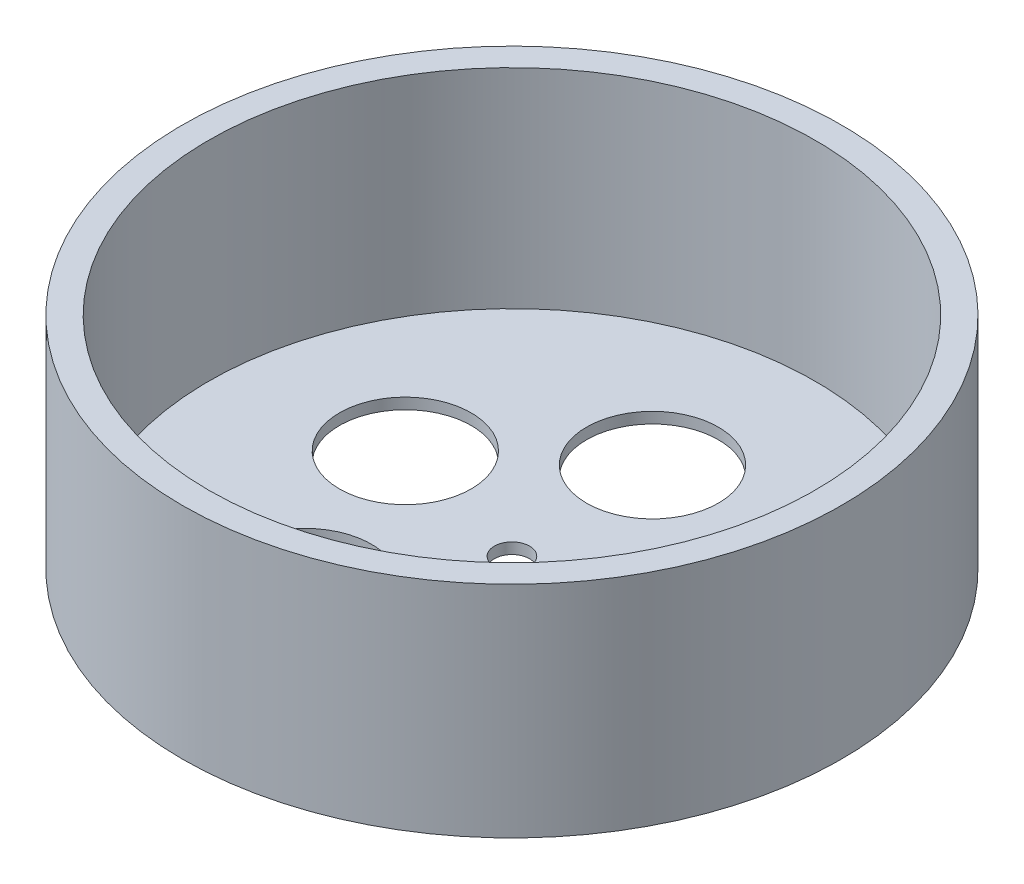
ISO-10303-21;
HEADER;
FILE_DESCRIPTION(('STEP AP214'),'2;1');
FILE_NAME('part.step','',(''),(''),'','','');
FILE_SCHEMA(('AUTOMOTIVE_DESIGN { 1 0 10303 214 1 1 1 1 }'));
ENDSEC;
DATA;
#1=APPLICATION_CONTEXT('core data for automotive mechanical design processes');
#2=APPLICATION_PROTOCOL_DEFINITION('international standard','automotive_design',2000,#1);
#3=PRODUCT_CONTEXT('',#1,'mechanical');
#4=PRODUCT('Part','Part','',(#3));
#5=PRODUCT_RELATED_PRODUCT_CATEGORY('part','',(#4));
#6=PRODUCT_DEFINITION_FORMATION('','',#4);
#7=PRODUCT_DEFINITION_CONTEXT('part definition',#1,'design');
#8=PRODUCT_DEFINITION('design','',#6,#7);
#9=PRODUCT_DEFINITION_SHAPE('','',#8);
#10=(LENGTH_UNIT() NAMED_UNIT(*) SI_UNIT(.MILLI.,.METRE.));
#11=(NAMED_UNIT(*) PLANE_ANGLE_UNIT() SI_UNIT($,.RADIAN.));
#12=(NAMED_UNIT(*) SI_UNIT($,.STERADIAN.) SOLID_ANGLE_UNIT());
#13=UNCERTAINTY_MEASURE_WITH_UNIT(LENGTH_MEASURE(1.E-05),#10,'distance_accuracy_value','');
#14=(GEOMETRIC_REPRESENTATION_CONTEXT(3) GLOBAL_UNCERTAINTY_ASSIGNED_CONTEXT((#13)) GLOBAL_UNIT_ASSIGNED_CONTEXT((#10,
#11,#12)) REPRESENTATION_CONTEXT('',''));
#15=CARTESIAN_POINT('',(0.,0.,0.));
#16=DIRECTION('',(0.,0.,1.));
#17=DIRECTION('',(1.,0.,0.));
#18=AXIS2_PLACEMENT_3D('',#15,#16,#17);
#19=CARTESIAN_POINT('',(0.,1.,0.));
#20=DIRECTION('',(0.,-1.,0.));
#21=DIRECTION('',(0.,0.,-1.));
#22=AXIS2_PLACEMENT_3D('',#19,#20,#21);
#23=CYLINDRICAL_SURFACE('',#22,1.5);
#24=CARTESIAN_POINT('',(0.,1.,0.));
#25=DIRECTION('',(0.,1.,0.));
#26=DIRECTION('',(0.,0.,1.));
#27=AXIS2_PLACEMENT_3D('',#24,#25,#26);
#28=CIRCLE('',#27,1.5);
#29=CARTESIAN_POINT('',(0.,1.,1.5));
#30=VERTEX_POINT('',#29);
#31=EDGE_CURVE('E10',#30,#30,#28,.T.);
#32=ORIENTED_EDGE('',*,*,#31,.F.);
#33=EDGE_LOOP('',(#32));
#34=FACE_BOUND('',#33,.T.);
#35=CARTESIAN_POINT('',(0.,0.,0.));
#36=DIRECTION('',(0.,1.,0.));
#37=DIRECTION('',(0.,0.,1.));
#38=AXIS2_PLACEMENT_3D('',#35,#36,#37);
#39=CIRCLE('',#38,1.5);
#40=CARTESIAN_POINT('',(0.,0.,1.5));
#41=VERTEX_POINT('',#40);
#42=EDGE_CURVE('E39',#41,#41,#39,.T.);
#43=ORIENTED_EDGE('',*,*,#42,.T.);
#44=EDGE_LOOP('',(#43));
#45=FACE_BOUND('',#44,.T.);
#46=ADVANCED_FACE('F36',(#34,#45),#23,.T.);
#47=CARTESIAN_POINT('',(0.,1.,0.));
#48=DIRECTION('',(0.,1.,0.));
#49=DIRECTION('',(0.,0.,1.));
#50=AXIS2_PLACEMENT_3D('',#47,#48,#49);
#51=PLANE('',#50);
#52=CARTESIAN_POINT('',(0.,1.,0.));
#53=DIRECTION('',(0.,1.,0.));
#54=DIRECTION('',(0.,0.,1.));
#55=AXIS2_PLACEMENT_3D('',#52,#53,#54);
#56=CIRCLE('',#55,1.38);
#57=CARTESIAN_POINT('',(0.,1.,1.38));
#58=VERTEX_POINT('',#57);
#59=EDGE_CURVE('E50',#58,#58,#56,.T.);
#60=ORIENTED_EDGE('',*,*,#59,.F.);
#61=EDGE_LOOP('',(#60));
#62=FACE_BOUND('',#61,.T.);
#63=ORIENTED_EDGE('',*,*,#31,.T.);
#64=EDGE_LOOP('',(#63));
#65=FACE_BOUND('',#64,.T.);
#66=ADVANCED_FACE('F133',(#62,#65),#51,.T.);
#67=CARTESIAN_POINT('',(0.,0.,0.));
#68=DIRECTION('',(0.,1.,0.));
#69=DIRECTION('',(0.,0.,1.));
#70=AXIS2_PLACEMENT_3D('',#67,#68,#69);
#71=PLANE('',#70);
#72=CARTESIAN_POINT('',(0.,0.,0.));
#73=DIRECTION('',(0.,1.,0.));
#74=DIRECTION('',(0.,0.,1.));
#75=AXIS2_PLACEMENT_3D('',#72,#73,#74);
#76=CIRCLE('',#75,0.08);
#77=CARTESIAN_POINT('',(0.,0.,0.08));
#78=VERTEX_POINT('',#77);
#79=EDGE_CURVE('E94',#78,#78,#76,.T.);
#80=ORIENTED_EDGE('',*,*,#79,.T.);
#81=EDGE_LOOP('',(#80));
#82=FACE_BOUND('',#81,.T.);
#83=CARTESIAN_POINT('',(0.43074259853327,0.,0.526175649197898));
#84=DIRECTION('',(0.,1.,0.));
#85=DIRECTION('',(0.,0.,1.));
#86=AXIS2_PLACEMENT_3D('',#83,#84,#85);
#87=CIRCLE('',#86,0.3);
#88=CARTESIAN_POINT('',(0.43074259853327,0.,0.826175649197898));
#89=VERTEX_POINT('',#88);
#90=EDGE_CURVE('E54',#89,#89,#87,.T.);
#91=ORIENTED_EDGE('',*,*,#90,.T.);
#92=EDGE_LOOP('',(#91));
#93=FACE_BOUND('',#92,.T.);
#94=CARTESIAN_POINT('',(0.633529563033521,0.,-0.247063337552526));
#95=DIRECTION('',(0.,1.,0.));
#96=DIRECTION('',(0.,0.,1.));
#97=AXIS2_PLACEMENT_3D('',#94,#95,#96);
#98=CIRCLE('',#97,0.3);
#99=CARTESIAN_POINT('',(0.633529563033521,0.,0.0529366624474737));
#100=VERTEX_POINT('',#99);
#101=EDGE_CURVE('E61',#100,#100,#98,.T.);
#102=ORIENTED_EDGE('',*,*,#101,.T.);
#103=EDGE_LOOP('',(#102));
#104=FACE_BOUND('',#103,.T.);
#105=CARTESIAN_POINT('',(-0.039199795700645,0.,-0.67886918917935));
#106=DIRECTION('',(0.,1.,0.));
#107=DIRECTION('',(0.,0.,1.));
#108=AXIS2_PLACEMENT_3D('',#105,#106,#107);
#109=CIRCLE('',#108,0.3);
#110=CARTESIAN_POINT('',(-0.039199795700645,0.,-0.37886918917935));
#111=VERTEX_POINT('',#110);
#112=EDGE_CURVE('E65',#111,#111,#109,.T.);
#113=ORIENTED_EDGE('',*,*,#112,.T.);
#114=EDGE_LOOP('',(#113));
#115=FACE_BOUND('',#114,.T.);
#116=CARTESIAN_POINT('',(-0.657756369128532,0.,-0.172500895275397));
#117=DIRECTION('',(0.,1.,0.));
#118=DIRECTION('',(0.,0.,1.));
#119=AXIS2_PLACEMENT_3D('',#116,#117,#118);
#120=CIRCLE('',#119,0.3);
#121=CARTESIAN_POINT('',(-0.657756369128532,0.,0.127499104724603));
#122=VERTEX_POINT('',#121);
#123=EDGE_CURVE('E69',#122,#122,#120,.T.);
#124=ORIENTED_EDGE('',*,*,#123,.T.);
#125=EDGE_LOOP('',(#124));
#126=FACE_BOUND('',#125,.T.);
#127=CARTESIAN_POINT('',(-0.36731599673747,0.,0.572257772809366));
#128=DIRECTION('',(0.,1.,0.));
#129=DIRECTION('',(0.,0.,1.));
#130=AXIS2_PLACEMENT_3D('',#127,#128,#129);
#131=CIRCLE('',#130,0.3);
#132=CARTESIAN_POINT('',(-0.36731599673747,0.,0.872257772809366));
#133=VERTEX_POINT('',#132);
#134=EDGE_CURVE('E73',#133,#133,#131,.T.);
#135=ORIENTED_EDGE('',*,*,#134,.T.);
#136=EDGE_LOOP('',(#135));
#137=FACE_BOUND('',#136,.T.);
#138=ORIENTED_EDGE('',*,*,#42,.F.);
#139=EDGE_LOOP('',(#138));
#140=FACE_BOUND('',#139,.T.);
#141=ADVANCED_FACE('F129',(#82,#93,#104,#115,#126,#137,#140),#71,.F.);
#142=CARTESIAN_POINT('',(0.,0.05,0.));
#143=DIRECTION('',(0.,1.,0.));
#144=DIRECTION('',(0.,0.,1.));
#145=AXIS2_PLACEMENT_3D('',#142,#143,#144);
#146=CYLINDRICAL_SURFACE('',#145,1.38);
#147=CARTESIAN_POINT('',(0.,0.05,0.));
#148=DIRECTION('',(0.,1.,0.));
#149=DIRECTION('',(0.,0.,1.));
#150=AXIS2_PLACEMENT_3D('',#147,#148,#149);
#151=CIRCLE('',#150,1.38);
#152=CARTESIAN_POINT('',(0.,0.05,1.38));
#153=VERTEX_POINT('',#152);
#154=EDGE_CURVE('E48',#153,#153,#151,.T.);
#155=ORIENTED_EDGE('',*,*,#154,.F.);
#156=EDGE_LOOP('',(#155));
#157=FACE_BOUND('',#156,.T.);
#158=ORIENTED_EDGE('',*,*,#59,.T.);
#159=EDGE_LOOP('',(#158));
#160=FACE_BOUND('',#159,.T.);
#161=ADVANCED_FACE('F113',(#157,#160),#146,.F.);
#162=CARTESIAN_POINT('',(0.,0.05,0.));
#163=DIRECTION('',(0.,1.,0.));
#164=DIRECTION('',(0.,0.,1.));
#165=AXIS2_PLACEMENT_3D('',#162,#163,#164);
#166=PLANE('',#165);
#167=CARTESIAN_POINT('',(0.,0.05,0.));
#168=DIRECTION('',(0.,1.,0.));
#169=DIRECTION('',(0.,0.,1.));
#170=AXIS2_PLACEMENT_3D('',#167,#168,#169);
#171=CIRCLE('',#170,0.08);
#172=CARTESIAN_POINT('',(0.,0.05,0.08));
#173=VERTEX_POINT('',#172);
#174=EDGE_CURVE('E101',#173,#173,#171,.T.);
#175=ORIENTED_EDGE('',*,*,#174,.F.);
#176=EDGE_LOOP('',(#175));
#177=FACE_BOUND('',#176,.T.);
#178=CARTESIAN_POINT('',(0.43074259853327,0.05,0.526175649197898));
#179=DIRECTION('',(0.,1.,0.));
#180=DIRECTION('',(0.,0.,1.));
#181=AXIS2_PLACEMENT_3D('',#178,#179,#180);
#182=CIRCLE('',#181,0.3);
#183=CARTESIAN_POINT('',(0.43074259853327,0.05,0.826175649197898));
#184=VERTEX_POINT('',#183);
#185=EDGE_CURVE('E81',#184,#184,#182,.T.);
#186=ORIENTED_EDGE('',*,*,#185,.F.);
#187=EDGE_LOOP('',(#186));
#188=FACE_BOUND('',#187,.T.);
#189=CARTESIAN_POINT('',(0.633529563033521,0.05,-0.247063337552526));
#190=DIRECTION('',(0.,1.,0.));
#191=DIRECTION('',(0.,0.,1.));
#192=AXIS2_PLACEMENT_3D('',#189,#190,#191);
#193=CIRCLE('',#192,0.3);
#194=CARTESIAN_POINT('',(0.633529563033521,0.05,0.0529366624474737));
#195=VERTEX_POINT('',#194);
#196=EDGE_CURVE('E82',#195,#195,#193,.T.);
#197=ORIENTED_EDGE('',*,*,#196,.F.);
#198=EDGE_LOOP('',(#197));
#199=FACE_BOUND('',#198,.T.);
#200=CARTESIAN_POINT('',(-0.039199795700645,0.05,-0.67886918917935));
#201=DIRECTION('',(0.,1.,0.));
#202=DIRECTION('',(0.,0.,1.));
#203=AXIS2_PLACEMENT_3D('',#200,#201,#202);
#204=CIRCLE('',#203,0.3);
#205=CARTESIAN_POINT('',(-0.039199795700645,0.05,-0.37886918917935));
#206=VERTEX_POINT('',#205);
#207=EDGE_CURVE('E86',#206,#206,#204,.T.);
#208=ORIENTED_EDGE('',*,*,#207,.F.);
#209=EDGE_LOOP('',(#208));
#210=FACE_BOUND('',#209,.T.);
#211=CARTESIAN_POINT('',(-0.657756369128532,0.05,-0.172500895275397));
#212=DIRECTION('',(0.,1.,0.));
#213=DIRECTION('',(0.,0.,1.));
#214=AXIS2_PLACEMENT_3D('',#211,#212,#213);
#215=CIRCLE('',#214,0.3);
#216=CARTESIAN_POINT('',(-0.657756369128532,0.05,0.127499104724603));
#217=VERTEX_POINT('',#216);
#218=EDGE_CURVE('E90',#217,#217,#215,.T.);
#219=ORIENTED_EDGE('',*,*,#218,.F.);
#220=EDGE_LOOP('',(#219));
#221=FACE_BOUND('',#220,.T.);
#222=CARTESIAN_POINT('',(-0.36731599673747,0.05,0.572257772809366));
#223=DIRECTION('',(0.,1.,0.));
#224=DIRECTION('',(0.,0.,1.));
#225=AXIS2_PLACEMENT_3D('',#222,#223,#224);
#226=CIRCLE('',#225,0.3);
#227=CARTESIAN_POINT('',(-0.36731599673747,0.05,0.872257772809366));
#228=VERTEX_POINT('',#227);
#229=EDGE_CURVE('E77',#228,#228,#226,.T.);
#230=ORIENTED_EDGE('',*,*,#229,.F.);
#231=EDGE_LOOP('',(#230));
#232=FACE_BOUND('',#231,.T.);
#233=ORIENTED_EDGE('',*,*,#154,.T.);
#234=EDGE_LOOP('',(#233));
#235=FACE_BOUND('',#234,.T.);
#236=ADVANCED_FACE('F109',(#177,#188,#199,#210,#221,#232,#235),#166,.T.);
#237=CARTESIAN_POINT('',(-0.36731599673747,-0.0299999999999999,0.572257772809366));
#238=DIRECTION('',(0.,1.,0.));
#239=DIRECTION('',(0.,0.,1.));
#240=AXIS2_PLACEMENT_3D('',#237,#238,#239);
#241=CYLINDRICAL_SURFACE('',#240,0.3);
#242=ORIENTED_EDGE('',*,*,#229,.T.);
#243=EDGE_LOOP('',(#242));
#244=FACE_BOUND('',#243,.T.);
#245=ORIENTED_EDGE('',*,*,#134,.F.);
#246=EDGE_LOOP('',(#245));
#247=FACE_BOUND('',#246,.T.);
#248=ADVANCED_FACE('F112',(#244,#247),#241,.F.);
#249=CARTESIAN_POINT('',(-0.657756369128532,-0.0299999999999999,-0.172500895275397));
#250=DIRECTION('',(0.,1.,0.));
#251=DIRECTION('',(0.,0.,1.));
#252=AXIS2_PLACEMENT_3D('',#249,#250,#251);
#253=CYLINDRICAL_SURFACE('',#252,0.3);
#254=ORIENTED_EDGE('',*,*,#218,.T.);
#255=EDGE_LOOP('',(#254));
#256=FACE_BOUND('',#255,.T.);
#257=ORIENTED_EDGE('',*,*,#123,.F.);
#258=EDGE_LOOP('',(#257));
#259=FACE_BOUND('',#258,.T.);
#260=ADVANCED_FACE('F145',(#256,#259),#253,.F.);
#261=CARTESIAN_POINT('',(-0.039199795700645,-0.0299999999999999,-0.67886918917935));
#262=DIRECTION('',(0.,1.,0.));
#263=DIRECTION('',(0.,0.,1.));
#264=AXIS2_PLACEMENT_3D('',#261,#262,#263);
#265=CYLINDRICAL_SURFACE('',#264,0.3);
#266=ORIENTED_EDGE('',*,*,#207,.T.);
#267=EDGE_LOOP('',(#266));
#268=FACE_BOUND('',#267,.T.);
#269=ORIENTED_EDGE('',*,*,#112,.F.);
#270=EDGE_LOOP('',(#269));
#271=FACE_BOUND('',#270,.T.);
#272=ADVANCED_FACE('F151',(#268,#271),#265,.F.);
#273=CARTESIAN_POINT('',(0.633529563033521,-0.0299999999999999,-0.247063337552526));
#274=DIRECTION('',(0.,1.,0.));
#275=DIRECTION('',(0.,0.,1.));
#276=AXIS2_PLACEMENT_3D('',#273,#274,#275);
#277=CYLINDRICAL_SURFACE('',#276,0.3);
#278=ORIENTED_EDGE('',*,*,#196,.T.);
#279=EDGE_LOOP('',(#278));
#280=FACE_BOUND('',#279,.T.);
#281=ORIENTED_EDGE('',*,*,#101,.F.);
#282=EDGE_LOOP('',(#281));
#283=FACE_BOUND('',#282,.T.);
#284=ADVANCED_FACE('F147',(#280,#283),#277,.F.);
#285=CARTESIAN_POINT('',(0.43074259853327,-0.0299999999999999,0.526175649197898));
#286=DIRECTION('',(0.,1.,0.));
#287=DIRECTION('',(0.,0.,1.));
#288=AXIS2_PLACEMENT_3D('',#285,#286,#287);
#289=CYLINDRICAL_SURFACE('',#288,0.3);
#290=ORIENTED_EDGE('',*,*,#185,.T.);
#291=EDGE_LOOP('',(#290));
#292=FACE_BOUND('',#291,.T.);
#293=ORIENTED_EDGE('',*,*,#90,.F.);
#294=EDGE_LOOP('',(#293));
#295=FACE_BOUND('',#294,.T.);
#296=ADVANCED_FACE('F150',(#292,#295),#289,.F.);
#297=CARTESIAN_POINT('',(0.,-0.0299999999999999,0.));
#298=DIRECTION('',(0.,1.,0.));
#299=DIRECTION('',(0.,0.,1.));
#300=AXIS2_PLACEMENT_3D('',#297,#298,#299);
#301=CYLINDRICAL_SURFACE('',#300,0.08);
#302=ORIENTED_EDGE('',*,*,#174,.T.);
#303=EDGE_LOOP('',(#302));
#304=FACE_BOUND('',#303,.T.);
#305=ORIENTED_EDGE('',*,*,#79,.F.);
#306=EDGE_LOOP('',(#305));
#307=FACE_BOUND('',#306,.T.);
#308=ADVANCED_FACE('F106',(#304,#307),#301,.F.);
#309=CLOSED_SHELL('',(#46,#66,#141,#161,#236,#248,#260,#272,#284,#296,#308));
#310=MANIFOLD_SOLID_BREP('B2',#309);
#311=ADVANCED_BREP_SHAPE_REPRESENTATION('',(#18,#310),#14);
#312=SHAPE_DEFINITION_REPRESENTATION(#9,#311);
ENDSEC;
END-ISO-10303-21;
